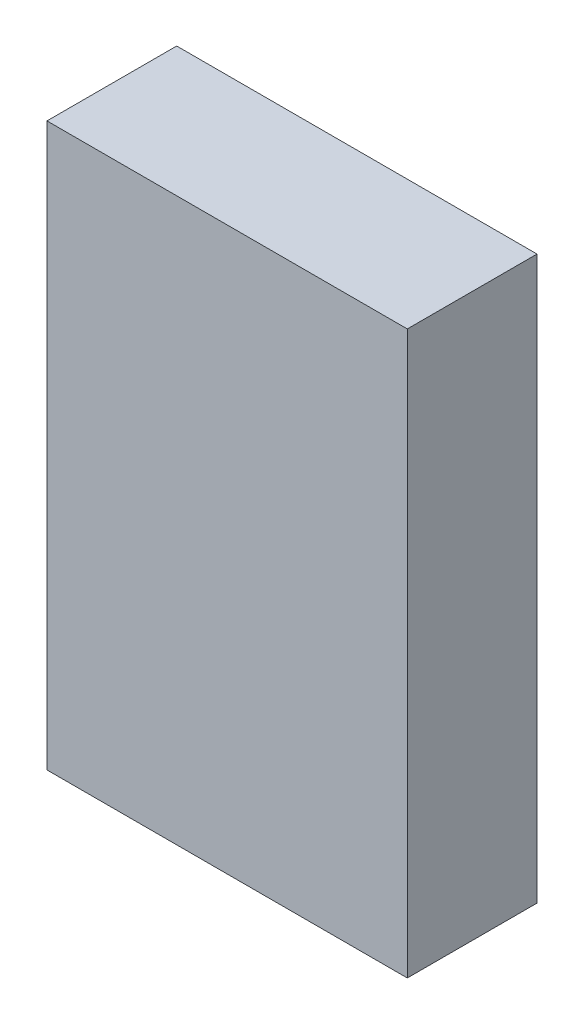
ISO-10303-21;
HEADER;
FILE_DESCRIPTION(('STEP AP214'),'2;1');
FILE_NAME('part.step','',(''),(''),'','','');
FILE_SCHEMA(('AUTOMOTIVE_DESIGN { 1 0 10303 214 1 1 1 1 }'));
ENDSEC;
DATA;
#1=APPLICATION_CONTEXT('core data for automotive mechanical design processes');
#2=APPLICATION_PROTOCOL_DEFINITION('international standard','automotive_design',2000,#1);
#3=PRODUCT_CONTEXT('',#1,'mechanical');
#4=PRODUCT('Part','Part','',(#3));
#5=PRODUCT_RELATED_PRODUCT_CATEGORY('part','',(#4));
#6=PRODUCT_DEFINITION_FORMATION('','',#4);
#7=PRODUCT_DEFINITION_CONTEXT('part definition',#1,'design');
#8=PRODUCT_DEFINITION('design','',#6,#7);
#9=PRODUCT_DEFINITION_SHAPE('','',#8);
#10=(LENGTH_UNIT() NAMED_UNIT(*) SI_UNIT(.MILLI.,.METRE.));
#11=(NAMED_UNIT(*) PLANE_ANGLE_UNIT() SI_UNIT($,.RADIAN.));
#12=(NAMED_UNIT(*) SI_UNIT($,.STERADIAN.) SOLID_ANGLE_UNIT());
#13=UNCERTAINTY_MEASURE_WITH_UNIT(LENGTH_MEASURE(1.E-05),#10,'distance_accuracy_value','');
#14=(GEOMETRIC_REPRESENTATION_CONTEXT(3) GLOBAL_UNCERTAINTY_ASSIGNED_CONTEXT((#13)) GLOBAL_UNIT_ASSIGNED_CONTEXT((#10,
#11,#12)) REPRESENTATION_CONTEXT('',''));
#15=CARTESIAN_POINT('',(0.,0.,0.));
#16=DIRECTION('',(0.,0.,1.));
#17=DIRECTION('',(1.,0.,0.));
#18=AXIS2_PLACEMENT_3D('',#15,#16,#17);
#19=CARTESIAN_POINT('',(-2.50000008,-3.89999982,1.79999894));
#20=DIRECTION('',(0.,0.,1.));
#21=DIRECTION('',(1.,0.,0.));
#22=AXIS2_PLACEMENT_3D('',#19,#20,#21);
#23=PLANE('',#22);
#24=DIRECTION('',(1.,0.,0.));
#25=VECTOR('',#24,1.);
#26=CARTESIAN_POINT('',(-2.50000008,3.89999982,1.79999894));
#27=LINE('',#26,#25);
#28=CARTESIAN_POINT('',(-2.50000008,3.89999982,1.79999894));
#29=VERTEX_POINT('',#28);
#30=CARTESIAN_POINT('',(2.50000008,3.89999982,1.79999894));
#31=VERTEX_POINT('',#30);
#32=EDGE_CURVE('E52',#29,#31,#27,.T.);
#33=ORIENTED_EDGE('',*,*,#32,.F.);
#34=DIRECTION('',(0.,1.,0.));
#35=VECTOR('',#34,1.);
#36=CARTESIAN_POINT('',(-2.50000008,-3.89999982,1.79999894));
#37=LINE('',#36,#35);
#38=CARTESIAN_POINT('',(-2.50000008,-3.89999982,1.79999894));
#39=VERTEX_POINT('',#38);
#40=EDGE_CURVE('E67',#39,#29,#37,.T.);
#41=ORIENTED_EDGE('',*,*,#40,.F.);
#42=DIRECTION('',(1.,0.,0.));
#43=VECTOR('',#42,1.);
#44=CARTESIAN_POINT('',(2.50000008,-3.89999982,1.79999894));
#45=LINE('',#44,#43);
#46=CARTESIAN_POINT('',(2.50000008,-3.89999982,1.79999894));
#47=VERTEX_POINT('',#46);
#48=EDGE_CURVE('E19',#47,#39,#45,.F.);
#49=ORIENTED_EDGE('',*,*,#48,.F.);
#50=DIRECTION('',(0.,1.,0.));
#51=VECTOR('',#50,1.);
#52=CARTESIAN_POINT('',(2.50000008,3.89999982,1.79999894));
#53=LINE('',#52,#51);
#54=EDGE_CURVE('E57',#31,#47,#53,.F.);
#55=ORIENTED_EDGE('',*,*,#54,.F.);
#56=EDGE_LOOP('',(#33,#41,#49,#55));
#57=FACE_BOUND('',#56,.T.);
#58=ADVANCED_FACE('F16',(#57),#23,.T.);
#59=CARTESIAN_POINT('',(2.50000008,-3.89999982,0.));
#60=DIRECTION('',(0.,-1.,0.));
#61=DIRECTION('',(0.,0.,-1.));
#62=AXIS2_PLACEMENT_3D('',#59,#60,#61);
#63=PLANE('',#62);
#64=DIRECTION('',(0.,0.,1.));
#65=VECTOR('',#64,1.);
#66=CARTESIAN_POINT('',(-2.50000008,-3.89999982,0.));
#67=LINE('',#66,#65);
#68=CARTESIAN_POINT('',(-2.50000008,-3.89999982,0.));
#69=VERTEX_POINT('',#68);
#70=EDGE_CURVE('E78',#69,#39,#67,.T.);
#71=ORIENTED_EDGE('',*,*,#70,.F.);
#72=DIRECTION('',(1.,0.,0.));
#73=VECTOR('',#72,1.);
#74=CARTESIAN_POINT('',(-2.50000008,-3.89999982,0.));
#75=LINE('',#74,#73);
#76=CARTESIAN_POINT('',(2.50000008,-3.89999982,0.));
#77=VERTEX_POINT('',#76);
#78=EDGE_CURVE('E73',#69,#77,#75,.T.);
#79=ORIENTED_EDGE('',*,*,#78,.T.);
#80=DIRECTION('',(0.,0.,-1.));
#81=VECTOR('',#80,1.);
#82=CARTESIAN_POINT('',(2.50000008,-3.89999982,0.));
#83=LINE('',#82,#81);
#84=EDGE_CURVE('E62',#47,#77,#83,.T.);
#85=ORIENTED_EDGE('',*,*,#84,.F.);
#86=ORIENTED_EDGE('',*,*,#48,.T.);
#87=EDGE_LOOP('',(#71,#79,#85,#86));
#88=FACE_BOUND('',#87,.T.);
#89=ADVANCED_FACE('F72',(#88),#63,.T.);
#90=CARTESIAN_POINT('',(2.50000008,3.89999982,0.));
#91=DIRECTION('',(1.,0.,0.));
#92=DIRECTION('',(0.,0.,-1.));
#93=AXIS2_PLACEMENT_3D('',#90,#91,#92);
#94=PLANE('',#93);
#95=ORIENTED_EDGE('',*,*,#84,.T.);
#96=DIRECTION('',(0.,1.,0.));
#97=VECTOR('',#96,1.);
#98=CARTESIAN_POINT('',(2.50000008,-3.89999982,0.));
#99=LINE('',#98,#97);
#100=CARTESIAN_POINT('',(2.50000008,3.89999982,0.));
#101=VERTEX_POINT('',#100);
#102=EDGE_CURVE('E83',#77,#101,#99,.T.);
#103=ORIENTED_EDGE('',*,*,#102,.T.);
#104=DIRECTION('',(0.,0.,1.));
#105=VECTOR('',#104,1.);
#106=CARTESIAN_POINT('',(2.50000008,3.89999982,0.));
#107=LINE('',#106,#105);
#108=EDGE_CURVE('E64',#31,#101,#107,.F.);
#109=ORIENTED_EDGE('',*,*,#108,.F.);
#110=ORIENTED_EDGE('',*,*,#54,.T.);
#111=EDGE_LOOP('',(#95,#103,#109,#110));
#112=FACE_BOUND('',#111,.T.);
#113=ADVANCED_FACE('F59',(#112),#94,.T.);
#114=CARTESIAN_POINT('',(-2.50000008,3.89999982,0.));
#115=DIRECTION('',(0.,1.,0.));
#116=DIRECTION('',(0.,0.,1.));
#117=AXIS2_PLACEMENT_3D('',#114,#115,#116);
#118=PLANE('',#117);
#119=ORIENTED_EDGE('',*,*,#108,.T.);
#120=DIRECTION('',(1.,0.,0.));
#121=VECTOR('',#120,1.);
#122=CARTESIAN_POINT('',(-2.50000008,3.89999982,0.));
#123=LINE('',#122,#121);
#124=CARTESIAN_POINT('',(-2.50000008,3.89999982,0.));
#125=VERTEX_POINT('',#124);
#126=EDGE_CURVE('E25',#101,#125,#123,.F.);
#127=ORIENTED_EDGE('',*,*,#126,.T.);
#128=DIRECTION('',(0.,0.,1.));
#129=VECTOR('',#128,1.);
#130=CARTESIAN_POINT('',(-2.50000008,3.89999982,0.));
#131=LINE('',#130,#129);
#132=EDGE_CURVE('E33',#29,#125,#131,.F.);
#133=ORIENTED_EDGE('',*,*,#132,.F.);
#134=ORIENTED_EDGE('',*,*,#32,.T.);
#135=EDGE_LOOP('',(#119,#127,#133,#134));
#136=FACE_BOUND('',#135,.T.);
#137=ADVANCED_FACE('F87',(#136),#118,.T.);
#138=CARTESIAN_POINT('',(-2.50000008,-3.89999982,0.));
#139=DIRECTION('',(-1.,0.,0.));
#140=DIRECTION('',(0.,0.,1.));
#141=AXIS2_PLACEMENT_3D('',#138,#139,#140);
#142=PLANE('',#141);
#143=ORIENTED_EDGE('',*,*,#132,.T.);
#144=DIRECTION('',(0.,1.,0.));
#145=VECTOR('',#144,1.);
#146=CARTESIAN_POINT('',(-2.50000008,-3.89999982,0.));
#147=LINE('',#146,#145);
#148=EDGE_CURVE('E11',#125,#69,#147,.F.);
#149=ORIENTED_EDGE('',*,*,#148,.T.);
#150=ORIENTED_EDGE('',*,*,#70,.T.);
#151=ORIENTED_EDGE('',*,*,#40,.T.);
#152=EDGE_LOOP('',(#143,#149,#150,#151));
#153=FACE_BOUND('',#152,.T.);
#154=ADVANCED_FACE('F90',(#153),#142,.T.);
#155=CARTESIAN_POINT('',(-2.50000008,-3.89999982,0.));
#156=DIRECTION('',(0.,0.,1.));
#157=DIRECTION('',(1.,0.,0.));
#158=AXIS2_PLACEMENT_3D('',#155,#156,#157);
#159=PLANE('',#158);
#160=ORIENTED_EDGE('',*,*,#126,.F.);
#161=ORIENTED_EDGE('',*,*,#102,.F.);
#162=ORIENTED_EDGE('',*,*,#78,.F.);
#163=ORIENTED_EDGE('',*,*,#148,.F.);
#164=EDGE_LOOP('',(#160,#161,#162,#163));
#165=FACE_BOUND('',#164,.T.);
#166=ADVANCED_FACE('F89',(#165),#159,.F.);
#167=CLOSED_SHELL('',(#58,#89,#113,#137,#154,#166));
#168=MANIFOLD_SOLID_BREP('B1',#167);
#169=ADVANCED_BREP_SHAPE_REPRESENTATION('',(#18,#168),#14);
#170=SHAPE_DEFINITION_REPRESENTATION(#9,#169);
ENDSEC;
END-ISO-10303-21;
